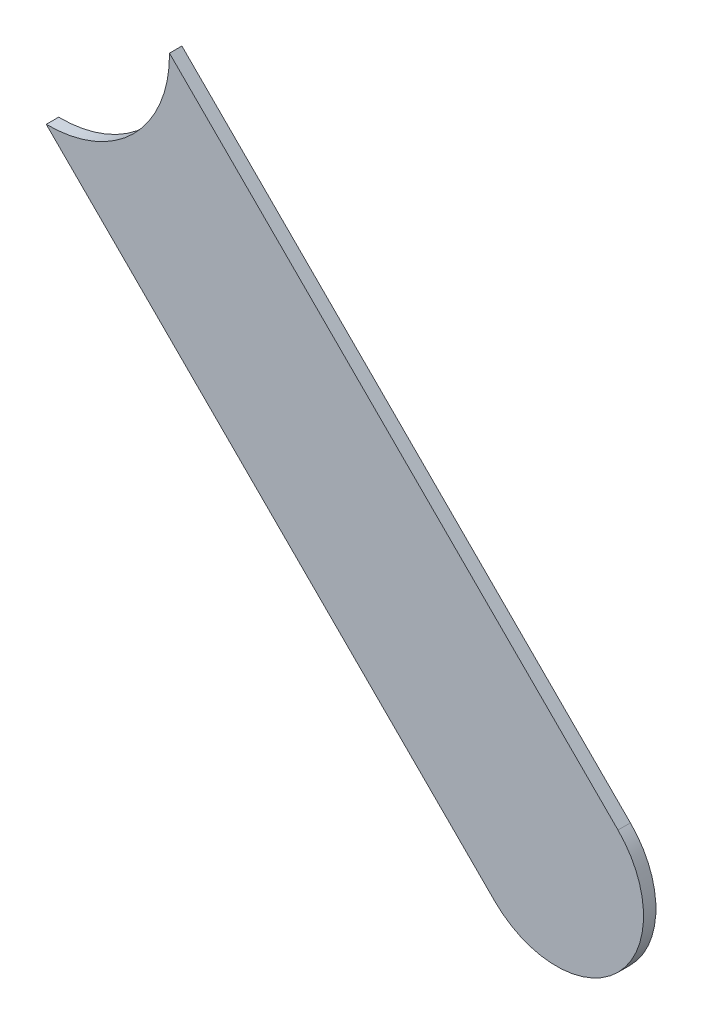
ISO-10303-21;
HEADER;
FILE_DESCRIPTION(('STEP AP214'),'2;1');
FILE_NAME('part.step','',(''),(''),'','','');
FILE_SCHEMA(('AUTOMOTIVE_DESIGN { 1 0 10303 214 1 1 1 1 }'));
ENDSEC;
DATA;
#1=APPLICATION_CONTEXT('core data for automotive mechanical design processes');
#2=APPLICATION_PROTOCOL_DEFINITION('international standard','automotive_design',2000,#1);
#3=PRODUCT_CONTEXT('',#1,'mechanical');
#4=PRODUCT('Part','Part','',(#3));
#5=PRODUCT_RELATED_PRODUCT_CATEGORY('part','',(#4));
#6=PRODUCT_DEFINITION_FORMATION('','',#4);
#7=PRODUCT_DEFINITION_CONTEXT('part definition',#1,'design');
#8=PRODUCT_DEFINITION('design','',#6,#7);
#9=PRODUCT_DEFINITION_SHAPE('','',#8);
#10=(LENGTH_UNIT() NAMED_UNIT(*) SI_UNIT(.MILLI.,.METRE.));
#11=(NAMED_UNIT(*) PLANE_ANGLE_UNIT() SI_UNIT($,.RADIAN.));
#12=(NAMED_UNIT(*) SI_UNIT($,.STERADIAN.) SOLID_ANGLE_UNIT());
#13=UNCERTAINTY_MEASURE_WITH_UNIT(LENGTH_MEASURE(1.E-05),#10,'distance_accuracy_value','');
#14=(GEOMETRIC_REPRESENTATION_CONTEXT(3) GLOBAL_UNCERTAINTY_ASSIGNED_CONTEXT((#13)) GLOBAL_UNIT_ASSIGNED_CONTEXT((#10,
#11,#12)) REPRESENTATION_CONTEXT('',''));
#15=CARTESIAN_POINT('',(0.,0.,0.));
#16=DIRECTION('',(0.,0.,1.));
#17=DIRECTION('',(1.,0.,0.));
#18=AXIS2_PLACEMENT_3D('',#15,#16,#17);
#19=CARTESIAN_POINT('',(38.3964470264152,40.6100081868912,0.));
#20=DIRECTION('',(0.707119083081673,0.707094479077396,0.));
#21=DIRECTION('',(0.707094479077396,-0.707119083081673,0.));
#22=AXIS2_PLACEMENT_3D('',#19,#20,#21);
#23=PLANE('',#22);
#24=DIRECTION('',(0.707094479077396,-0.707119083081673,0.));
#25=VECTOR('',#24,1.);
#26=CARTESIAN_POINT('',(38.22324588,40.78321536,0.03556));
#27=LINE('',#26,#25);
#28=CARTESIAN_POINT('',(38.3964470264152,40.6100081868912,0.03556));
#29=VERTEX_POINT('',#28);
#30=CARTESIAN_POINT('',(39.68318708,39.32322336,0.03556));
#31=VERTEX_POINT('',#30);
#32=EDGE_CURVE('E11',#29,#31,#27,.T.);
#33=ORIENTED_EDGE('',*,*,#32,.F.);
#34=DIRECTION('',(0.,0.,1.));
#35=VECTOR('',#34,1.);
#36=CARTESIAN_POINT('',(38.3964470264152,40.6100081868912,0.));
#37=LINE('',#36,#35);
#38=CARTESIAN_POINT('',(38.3964470264152,40.6100081868912,0.));
#39=VERTEX_POINT('',#38);
#40=EDGE_CURVE('E24',#39,#29,#37,.T.);
#41=ORIENTED_EDGE('',*,*,#40,.F.);
#42=DIRECTION('',(0.707094479077396,-0.707119083081673,0.));
#43=VECTOR('',#42,1.);
#44=CARTESIAN_POINT('',(38.22324588,40.78321536,0.));
#45=LINE('',#44,#43);
#46=CARTESIAN_POINT('',(39.68318708,39.32322336,0.));
#47=VERTEX_POINT('',#46);
#48=EDGE_CURVE('E82',#39,#47,#45,.T.);
#49=ORIENTED_EDGE('',*,*,#48,.T.);
#50=DIRECTION('',(0.,0.,1.));
#51=VECTOR('',#50,1.);
#52=CARTESIAN_POINT('',(39.68318708,39.32322336,0.));
#53=LINE('',#52,#51);
#54=EDGE_CURVE('E37',#47,#31,#53,.T.);
#55=ORIENTED_EDGE('',*,*,#54,.T.);
#56=EDGE_LOOP('',(#33,#41,#49,#55));
#57=FACE_BOUND('',#56,.T.);
#58=ADVANCED_FACE('F17',(#57),#23,.F.);
#59=CARTESIAN_POINT('',(39.859966,39.4999972,0.));
#60=DIRECTION('',(0.,0.,-1.));
#61=DIRECTION('',(-0.707116941131692,-0.707096621095419,0.));
#62=AXIS2_PLACEMENT_3D('',#59,#60,#61);
#63=CYLINDRICAL_SURFACE('',#62,0.249999554129026);
#64=CARTESIAN_POINT('',(39.859966,39.4999972,0.03556));
#65=DIRECTION('',(0.,0.,1.));
#66=DIRECTION('',(-0.707116941131692,-0.707096621095419,0.));
#67=AXIS2_PLACEMENT_3D('',#64,#65,#66);
#68=CIRCLE('',#67,0.249999554129026);
#69=CARTESIAN_POINT('',(40.03674492,39.67677104,0.03556));
#70=VERTEX_POINT('',#69);
#71=EDGE_CURVE('E97',#31,#70,#68,.T.);
#72=ORIENTED_EDGE('',*,*,#71,.F.);
#73=ORIENTED_EDGE('',*,*,#54,.F.);
#74=CARTESIAN_POINT('',(39.859966,39.4999972,0.));
#75=DIRECTION('',(0.,0.,1.));
#76=DIRECTION('',(-0.707116941131692,-0.707096621095419,0.));
#77=AXIS2_PLACEMENT_3D('',#74,#75,#76);
#78=CIRCLE('',#77,0.249999554129026);
#79=CARTESIAN_POINT('',(40.03674492,39.67677104,0.));
#80=VERTEX_POINT('',#79);
#81=EDGE_CURVE('E94',#47,#80,#78,.T.);
#82=ORIENTED_EDGE('',*,*,#81,.T.);
#83=DIRECTION('',(0.,0.,1.));
#84=VECTOR('',#83,1.);
#85=CARTESIAN_POINT('',(40.03674492,39.67677104,0.));
#86=LINE('',#85,#84);
#87=EDGE_CURVE('E92',#80,#70,#86,.T.);
#88=ORIENTED_EDGE('',*,*,#87,.T.);
#89=EDGE_LOOP('',(#72,#73,#82,#88));
#90=FACE_BOUND('',#89,.T.);
#91=ADVANCED_FACE('F103',(#90),#63,.T.);
#92=CARTESIAN_POINT('',(40.03674492,39.67677104,0.));
#93=DIRECTION('',(-0.707119083081675,-0.707094479077394,0.));
#94=DIRECTION('',(-0.707094479077394,0.707119083081675,0.));
#95=AXIS2_PLACEMENT_3D('',#92,#93,#94);
#96=PLANE('',#95);
#97=DIRECTION('',(-0.707094479077394,0.707119083081675,0.));
#98=VECTOR('',#97,1.);
#99=CARTESIAN_POINT('',(40.03674492,39.67677104,0.03556));
#100=LINE('',#99,#98);
#101=CARTESIAN_POINT('',(38.7500059373867,40.9635547958825,0.03556));
#102=VERTEX_POINT('',#101);
#103=EDGE_CURVE('E89',#70,#102,#100,.T.);
#104=ORIENTED_EDGE('',*,*,#103,.F.);
#105=ORIENTED_EDGE('',*,*,#87,.F.);
#106=DIRECTION('',(-0.707094479077394,0.707119083081675,0.));
#107=VECTOR('',#106,1.);
#108=CARTESIAN_POINT('',(40.03674492,39.67677104,0.));
#109=LINE('',#108,#107);
#110=CARTESIAN_POINT('',(38.7500059373867,40.9635547958825,0.));
#111=VERTEX_POINT('',#110);
#112=EDGE_CURVE('E87',#80,#111,#109,.T.);
#113=ORIENTED_EDGE('',*,*,#112,.T.);
#114=DIRECTION('',(0.,0.,1.));
#115=VECTOR('',#114,1.);
#116=CARTESIAN_POINT('',(38.7500059373867,40.9635547958825,0.));
#117=LINE('',#116,#115);
#118=EDGE_CURVE('E69',#111,#102,#117,.T.);
#119=ORIENTED_EDGE('',*,*,#118,.T.);
#120=EDGE_LOOP('',(#104,#105,#113,#119));
#121=FACE_BOUND('',#120,.T.);
#122=ADVANCED_FACE('F108',(#121),#96,.F.);
#123=CARTESIAN_POINT('',(38.4000248,40.9599892,0.));
#124=DIRECTION('',(0.,0.,-1.));
#125=DIRECTION('',(1.,0.,0.));
#126=AXIS2_PLACEMENT_3D('',#123,#124,#125);
#127=CYLINDRICAL_SURFACE('',#126,0.3499993);
#128=DIRECTION('',(0.,0.,1.));
#129=VECTOR('',#128,1.);
#130=CARTESIAN_POINT('',(38.7500241,40.9599892,0.));
#131=LINE('',#130,#129);
#132=CARTESIAN_POINT('',(38.7500241,40.9599892,0.));
#133=VERTEX_POINT('',#132);
#134=CARTESIAN_POINT('',(38.7500241,40.9599892,0.03556));
#135=VERTEX_POINT('',#134);
#136=EDGE_CURVE('E59',#133,#135,#131,.T.);
#137=ORIENTED_EDGE('',*,*,#136,.T.);
#138=CARTESIAN_POINT('',(38.4000248,40.9599892,0.03556));
#139=DIRECTION('',(0.,0.,1.));
#140=DIRECTION('',(1.,0.,0.));
#141=AXIS2_PLACEMENT_3D('',#138,#139,#140);
#142=CIRCLE('',#141,0.3499993);
#143=EDGE_CURVE('E70',#135,#102,#142,.T.);
#144=ORIENTED_EDGE('',*,*,#143,.T.);
#145=ORIENTED_EDGE('',*,*,#118,.F.);
#146=CARTESIAN_POINT('',(38.4000248,40.9599892,0.));
#147=DIRECTION('',(0.,0.,1.));
#148=DIRECTION('',(1.,0.,0.));
#149=AXIS2_PLACEMENT_3D('',#146,#147,#148);
#150=CIRCLE('',#149,0.3499993);
#151=EDGE_CURVE('E73',#133,#111,#150,.T.);
#152=ORIENTED_EDGE('',*,*,#151,.F.);
#153=EDGE_LOOP('',(#137,#144,#145,#152));
#154=FACE_BOUND('',#153,.T.);
#155=ADVANCED_FACE('F74',(#154),#127,.F.);
#156=CARTESIAN_POINT('',(38.4000248,40.9599892,0.));
#157=DIRECTION('',(0.,0.,-1.));
#158=DIRECTION('',(1.,0.,0.));
#159=AXIS2_PLACEMENT_3D('',#156,#157,#158);
#160=CYLINDRICAL_SURFACE('',#159,0.3499993);
#161=ORIENTED_EDGE('',*,*,#40,.T.);
#162=CARTESIAN_POINT('',(38.4000248,40.9599892,0.03556));
#163=DIRECTION('',(0.,0.,1.));
#164=DIRECTION('',(1.,0.,0.));
#165=AXIS2_PLACEMENT_3D('',#162,#163,#164);
#166=CIRCLE('',#165,0.3499993);
#167=EDGE_CURVE('E65',#29,#135,#166,.T.);
#168=ORIENTED_EDGE('',*,*,#167,.T.);
#169=ORIENTED_EDGE('',*,*,#136,.F.);
#170=EDGE_CURVE('E63',#39,#133,#150,.T.);
#171=ORIENTED_EDGE('',*,*,#170,.F.);
#172=EDGE_LOOP('',(#161,#168,#169,#171));
#173=FACE_BOUND('',#172,.T.);
#174=ADVANCED_FACE('F61',(#173),#160,.F.);
#175=CARTESIAN_POINT('',(38.22324588,40.78321536,0.));
#176=DIRECTION('',(0.,0.,-1.));
#177=DIRECTION('',(-1.,0.,0.));
#178=AXIS2_PLACEMENT_3D('',#175,#176,#177);
#179=PLANE('',#178);
#180=ORIENTED_EDGE('',*,*,#48,.F.);
#181=ORIENTED_EDGE('',*,*,#170,.T.);
#182=ORIENTED_EDGE('',*,*,#151,.T.);
#183=ORIENTED_EDGE('',*,*,#112,.F.);
#184=ORIENTED_EDGE('',*,*,#81,.F.);
#185=EDGE_LOOP('',(#180,#181,#182,#183,#184));
#186=FACE_BOUND('',#185,.T.);
#187=ADVANCED_FACE('F80',(#186),#179,.T.);
#188=CARTESIAN_POINT('',(38.22324588,40.78321536,0.03556));
#189=DIRECTION('',(0.,0.,-1.));
#190=DIRECTION('',(-1.,0.,0.));
#191=AXIS2_PLACEMENT_3D('',#188,#189,#190);
#192=PLANE('',#191);
#193=ORIENTED_EDGE('',*,*,#167,.F.);
#194=ORIENTED_EDGE('',*,*,#32,.T.);
#195=ORIENTED_EDGE('',*,*,#71,.T.);
#196=ORIENTED_EDGE('',*,*,#103,.T.);
#197=ORIENTED_EDGE('',*,*,#143,.F.);
#198=EDGE_LOOP('',(#193,#194,#195,#196,#197));
#199=FACE_BOUND('',#198,.T.);
#200=ADVANCED_FACE('F106',(#199),#192,.F.);
#201=CLOSED_SHELL('',(#58,#91,#122,#155,#174,#187,#200));
#202=MANIFOLD_SOLID_BREP('B1',#201);
#203=ADVANCED_BREP_SHAPE_REPRESENTATION('',(#18,#202),#14);
#204=SHAPE_DEFINITION_REPRESENTATION(#9,#203);
ENDSEC;
END-ISO-10303-21;
